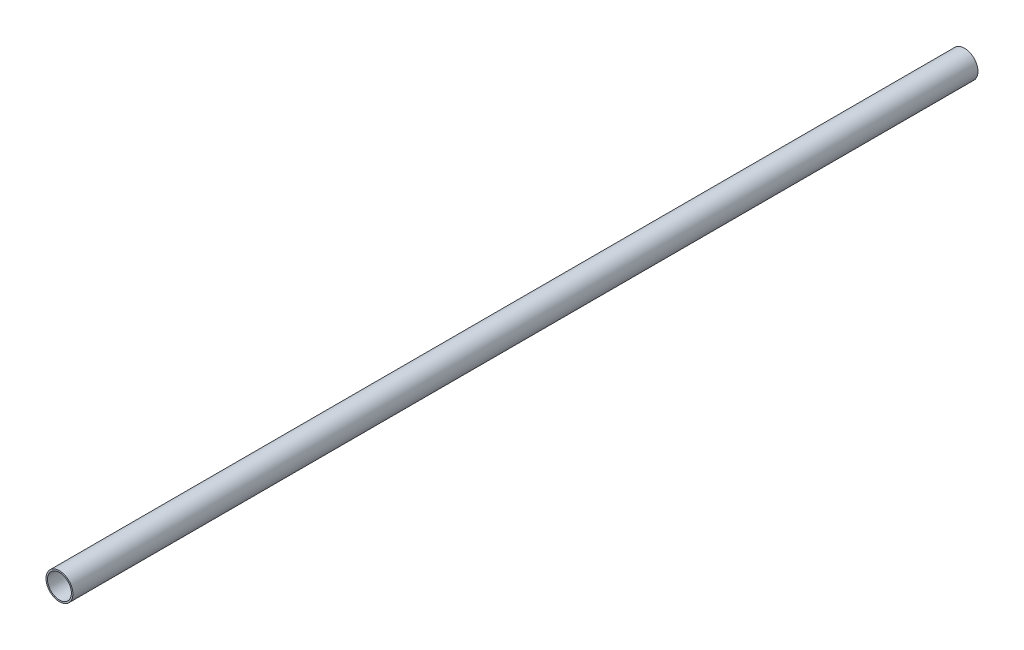
ISO-10303-21;
HEADER;
FILE_DESCRIPTION(('STEP AP214'),'2;1');
FILE_NAME('part.step','',(''),(''),'','','');
FILE_SCHEMA(('AUTOMOTIVE_DESIGN { 1 0 10303 214 1 1 1 1 }'));
ENDSEC;
DATA;
#1=APPLICATION_CONTEXT('core data for automotive mechanical design processes');
#2=APPLICATION_PROTOCOL_DEFINITION('international standard','automotive_design',2000,#1);
#3=PRODUCT_CONTEXT('',#1,'mechanical');
#4=PRODUCT('Part','Part','',(#3));
#5=PRODUCT_RELATED_PRODUCT_CATEGORY('part','',(#4));
#6=PRODUCT_DEFINITION_FORMATION('','',#4);
#7=PRODUCT_DEFINITION_CONTEXT('part definition',#1,'design');
#8=PRODUCT_DEFINITION('design','',#6,#7);
#9=PRODUCT_DEFINITION_SHAPE('','',#8);
#10=(LENGTH_UNIT() NAMED_UNIT(*) SI_UNIT(.MILLI.,.METRE.));
#11=(NAMED_UNIT(*) PLANE_ANGLE_UNIT() SI_UNIT($,.RADIAN.));
#12=(NAMED_UNIT(*) SI_UNIT($,.STERADIAN.) SOLID_ANGLE_UNIT());
#13=UNCERTAINTY_MEASURE_WITH_UNIT(LENGTH_MEASURE(1.E-05),#10,'distance_accuracy_value','');
#14=(GEOMETRIC_REPRESENTATION_CONTEXT(3) GLOBAL_UNCERTAINTY_ASSIGNED_CONTEXT((#13)) GLOBAL_UNIT_ASSIGNED_CONTEXT((#10,
#11,#12)) REPRESENTATION_CONTEXT('',''));
#15=CARTESIAN_POINT('',(0.,0.,0.));
#16=DIRECTION('',(0.,0.,1.));
#17=DIRECTION('',(1.,0.,0.));
#18=AXIS2_PLACEMENT_3D('',#15,#16,#17);
#19=CARTESIAN_POINT('',(0.,0.,266.7));
#20=DIRECTION('',(0.,0.,1.));
#21=DIRECTION('',(1.,0.,0.));
#22=AXIS2_PLACEMENT_3D('',#19,#20,#21);
#23=PLANE('',#22);
#24=CARTESIAN_POINT('',(0.,0.,266.7));
#25=DIRECTION('',(0.,0.,1.));
#26=DIRECTION('',(1.,0.,0.));
#27=AXIS2_PLACEMENT_3D('',#24,#25,#26);
#28=CIRCLE('',#27,7.9375);
#29=CARTESIAN_POINT('',(7.9375,0.,266.7));
#30=VERTEX_POINT('',#29);
#31=EDGE_CURVE('E10',#30,#30,#28,.T.);
#32=ORIENTED_EDGE('',*,*,#31,.T.);
#33=EDGE_LOOP('',(#32));
#34=FACE_BOUND('',#33,.T.);
#35=CARTESIAN_POINT('',(0.,0.,266.7));
#36=DIRECTION('',(0.,0.,1.));
#37=DIRECTION('',(1.,0.,0.));
#38=AXIS2_PLACEMENT_3D('',#35,#36,#37);
#39=CIRCLE('',#38,7.0485);
#40=CARTESIAN_POINT('',(7.0485,0.,266.7));
#41=VERTEX_POINT('',#40);
#42=EDGE_CURVE('E58',#41,#41,#39,.T.);
#43=ORIENTED_EDGE('',*,*,#42,.F.);
#44=EDGE_LOOP('',(#43));
#45=FACE_BOUND('',#44,.T.);
#46=ADVANCED_FACE('F45',(#34,#45),#23,.T.);
#47=CARTESIAN_POINT('',(0.,0.,-266.7));
#48=DIRECTION('',(0.,0.,1.));
#49=DIRECTION('',(1.,0.,0.));
#50=AXIS2_PLACEMENT_3D('',#47,#48,#49);
#51=PLANE('',#50);
#52=CARTESIAN_POINT('',(0.,0.,-266.7));
#53=DIRECTION('',(0.,0.,1.));
#54=DIRECTION('',(1.,0.,0.));
#55=AXIS2_PLACEMENT_3D('',#52,#53,#54);
#56=CIRCLE('',#55,7.9375);
#57=CARTESIAN_POINT('',(7.9375,0.,-266.7));
#58=VERTEX_POINT('',#57);
#59=EDGE_CURVE('E49',#58,#58,#56,.T.);
#60=ORIENTED_EDGE('',*,*,#59,.F.);
#61=EDGE_LOOP('',(#60));
#62=FACE_BOUND('',#61,.T.);
#63=CARTESIAN_POINT('',(0.,0.,-266.7));
#64=DIRECTION('',(0.,0.,1.));
#65=DIRECTION('',(1.,0.,0.));
#66=AXIS2_PLACEMENT_3D('',#63,#64,#65);
#67=CIRCLE('',#66,7.0485);
#68=CARTESIAN_POINT('',(7.0485,0.,-266.7));
#69=VERTEX_POINT('',#68);
#70=EDGE_CURVE('E60',#69,#69,#67,.T.);
#71=ORIENTED_EDGE('',*,*,#70,.T.);
#72=EDGE_LOOP('',(#71));
#73=FACE_BOUND('',#72,.T.);
#74=ADVANCED_FACE('F72',(#62,#73),#51,.F.);
#75=CARTESIAN_POINT('',(0.,0.,266.7));
#76=DIRECTION('',(0.,0.,-1.));
#77=DIRECTION('',(-1.,0.,0.));
#78=AXIS2_PLACEMENT_3D('',#75,#76,#77);
#79=CYLINDRICAL_SURFACE('',#78,7.9375);
#80=ORIENTED_EDGE('',*,*,#31,.F.);
#81=EDGE_LOOP('',(#80));
#82=FACE_BOUND('',#81,.T.);
#83=ORIENTED_EDGE('',*,*,#59,.T.);
#84=EDGE_LOOP('',(#83));
#85=FACE_BOUND('',#84,.T.);
#86=ADVANCED_FACE('F47',(#82,#85),#79,.T.);
#87=CARTESIAN_POINT('',(0.,0.,266.7));
#88=DIRECTION('',(0.,0.,-1.));
#89=DIRECTION('',(-1.,0.,0.));
#90=AXIS2_PLACEMENT_3D('',#87,#88,#89);
#91=CYLINDRICAL_SURFACE('',#90,7.0485);
#92=ORIENTED_EDGE('',*,*,#42,.T.);
#93=EDGE_LOOP('',(#92));
#94=FACE_BOUND('',#93,.T.);
#95=ORIENTED_EDGE('',*,*,#70,.F.);
#96=EDGE_LOOP('',(#95));
#97=FACE_BOUND('',#96,.T.);
#98=ADVANCED_FACE('F68',(#94,#97),#91,.F.);
#99=CLOSED_SHELL('',(#46,#74,#86,#98));
#100=MANIFOLD_SOLID_BREP('B2',#99);
#101=ADVANCED_BREP_SHAPE_REPRESENTATION('',(#18,#100),#14);
#102=SHAPE_DEFINITION_REPRESENTATION(#9,#101);
ENDSEC;
END-ISO-10303-21;
